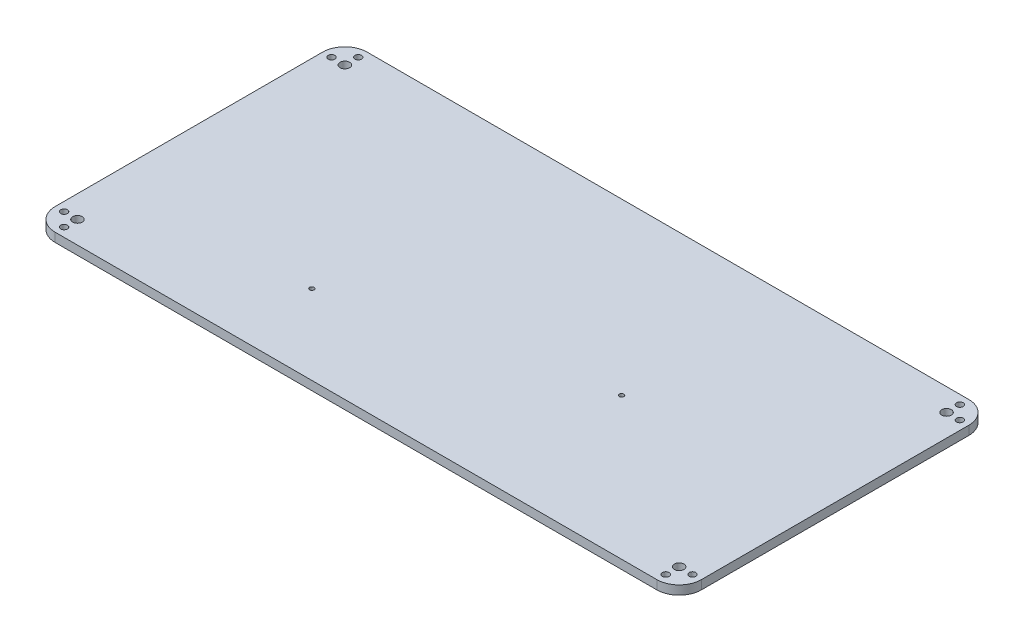
ISO-10303-21;
HEADER;
FILE_DESCRIPTION(('STEP AP214'),'2;1');
FILE_NAME('part.step','',(''),(''),'','','');
FILE_SCHEMA(('AUTOMOTIVE_DESIGN { 1 0 10303 214 1 1 1 1 }'));
ENDSEC;
DATA;
#1=APPLICATION_CONTEXT('core data for automotive mechanical design processes');
#2=APPLICATION_PROTOCOL_DEFINITION('international standard','automotive_design',2000,#1);
#3=PRODUCT_CONTEXT('',#1,'mechanical');
#4=PRODUCT('Part','Part','',(#3));
#5=PRODUCT_RELATED_PRODUCT_CATEGORY('part','',(#4));
#6=PRODUCT_DEFINITION_FORMATION('','',#4);
#7=PRODUCT_DEFINITION_CONTEXT('part definition',#1,'design');
#8=PRODUCT_DEFINITION('design','',#6,#7);
#9=PRODUCT_DEFINITION_SHAPE('','',#8);
#10=(LENGTH_UNIT() NAMED_UNIT(*) SI_UNIT(.MILLI.,.METRE.));
#11=(NAMED_UNIT(*) PLANE_ANGLE_UNIT() SI_UNIT($,.RADIAN.));
#12=(NAMED_UNIT(*) SI_UNIT($,.STERADIAN.) SOLID_ANGLE_UNIT());
#13=UNCERTAINTY_MEASURE_WITH_UNIT(LENGTH_MEASURE(1.E-05),#10,'distance_accuracy_value','');
#14=(GEOMETRIC_REPRESENTATION_CONTEXT(3) GLOBAL_UNCERTAINTY_ASSIGNED_CONTEXT((#13)) GLOBAL_UNIT_ASSIGNED_CONTEXT((#10,
#11,#12)) REPRESENTATION_CONTEXT('',''));
#15=CARTESIAN_POINT('',(0.,0.,0.));
#16=DIRECTION('',(0.,0.,1.));
#17=DIRECTION('',(1.,0.,0.));
#18=AXIS2_PLACEMENT_3D('',#15,#16,#17);
#19=CARTESIAN_POINT('',(0.,4.,70.));
#20=DIRECTION('',(0.,0.,1.));
#21=DIRECTION('',(1.,0.,0.));
#22=AXIS2_PLACEMENT_3D('',#19,#20,#21);
#23=PLANE('',#22);
#24=DIRECTION('',(-1.,0.,0.));
#25=VECTOR('',#24,1.);
#26=CARTESIAN_POINT('',(0.,0.,70.));
#27=LINE('',#26,#25);
#28=CARTESIAN_POINT('',(135.,0.,70.));
#29=VERTEX_POINT('',#28);
#30=CARTESIAN_POINT('',(-135.,0.,70.));
#31=VERTEX_POINT('',#30);
#32=EDGE_CURVE('E85',#29,#31,#27,.T.);
#33=ORIENTED_EDGE('',*,*,#32,.F.);
#34=DIRECTION('',(0.,-1.,0.));
#35=VECTOR('',#34,1.);
#36=CARTESIAN_POINT('',(135.,4.,70.));
#37=LINE('',#36,#35);
#38=CARTESIAN_POINT('',(135.,4.,70.));
#39=VERTEX_POINT('',#38);
#40=EDGE_CURVE('E11',#39,#29,#37,.T.);
#41=ORIENTED_EDGE('',*,*,#40,.F.);
#42=DIRECTION('',(-1.,0.,0.));
#43=VECTOR('',#42,1.);
#44=CARTESIAN_POINT('',(0.,4.,70.));
#45=LINE('',#44,#43);
#46=CARTESIAN_POINT('',(-135.,4.,70.));
#47=VERTEX_POINT('',#46);
#48=EDGE_CURVE('E71',#39,#47,#45,.T.);
#49=ORIENTED_EDGE('',*,*,#48,.T.);
#50=DIRECTION('',(0.,-1.,0.));
#51=VECTOR('',#50,1.);
#52=CARTESIAN_POINT('',(-135.,4.,70.));
#53=LINE('',#52,#51);
#54=EDGE_CURVE('E96',#47,#31,#53,.T.);
#55=ORIENTED_EDGE('',*,*,#54,.T.);
#56=EDGE_LOOP('',(#33,#41,#49,#55));
#57=FACE_BOUND('',#56,.T.);
#58=ADVANCED_FACE('F37',(#57),#23,.T.);
#59=CARTESIAN_POINT('',(135.,4.,60.));
#60=DIRECTION('',(0.,-1.,0.));
#61=DIRECTION('',(0.,0.,-1.));
#62=AXIS2_PLACEMENT_3D('',#59,#60,#61);
#63=CYLINDRICAL_SURFACE('',#62,10.);
#64=CARTESIAN_POINT('',(135.,0.,60.));
#65=DIRECTION('',(0.,1.,0.));
#66=DIRECTION('',(0.,0.,1.));
#67=AXIS2_PLACEMENT_3D('',#64,#65,#66);
#68=CIRCLE('',#67,10.);
#69=CARTESIAN_POINT('',(145.,0.,59.9999999999999));
#70=VERTEX_POINT('',#69);
#71=EDGE_CURVE('E93',#29,#70,#68,.T.);
#72=ORIENTED_EDGE('',*,*,#71,.T.);
#73=DIRECTION('',(0.,-1.,0.));
#74=VECTOR('',#73,1.);
#75=CARTESIAN_POINT('',(145.,4.,59.9999999999999));
#76=LINE('',#75,#74);
#77=CARTESIAN_POINT('',(145.,4.,59.9999999999999));
#78=VERTEX_POINT('',#77);
#79=EDGE_CURVE('E46',#78,#70,#76,.T.);
#80=ORIENTED_EDGE('',*,*,#79,.F.);
#81=CARTESIAN_POINT('',(135.,4.,60.));
#82=DIRECTION('',(0.,1.,0.));
#83=DIRECTION('',(0.,0.,1.));
#84=AXIS2_PLACEMENT_3D('',#81,#82,#83);
#85=CIRCLE('',#84,10.);
#86=EDGE_CURVE('E55',#39,#78,#85,.T.);
#87=ORIENTED_EDGE('',*,*,#86,.F.);
#88=ORIENTED_EDGE('',*,*,#40,.T.);
#89=EDGE_LOOP('',(#72,#80,#87,#88));
#90=FACE_BOUND('',#89,.T.);
#91=ADVANCED_FACE('F278',(#90),#63,.T.);
#92=CARTESIAN_POINT('',(145.,4.,0.));
#93=DIRECTION('',(1.,0.,0.));
#94=DIRECTION('',(0.,0.,-1.));
#95=AXIS2_PLACEMENT_3D('',#92,#93,#94);
#96=PLANE('',#95);
#97=DIRECTION('',(0.,0.,1.));
#98=VECTOR('',#97,1.);
#99=CARTESIAN_POINT('',(145.,0.,0.));
#100=LINE('',#99,#98);
#101=CARTESIAN_POINT('',(145.,0.,-59.9999999999999));
#102=VERTEX_POINT('',#101);
#103=EDGE_CURVE('E138',#102,#70,#100,.T.);
#104=ORIENTED_EDGE('',*,*,#103,.F.);
#105=DIRECTION('',(0.,-1.,0.));
#106=VECTOR('',#105,1.);
#107=CARTESIAN_POINT('',(145.,4.,-59.9999999999999));
#108=LINE('',#107,#106);
#109=CARTESIAN_POINT('',(145.,4.,-59.9999999999999));
#110=VERTEX_POINT('',#109);
#111=EDGE_CURVE('E188',#110,#102,#108,.T.);
#112=ORIENTED_EDGE('',*,*,#111,.F.);
#113=DIRECTION('',(0.,0.,1.));
#114=VECTOR('',#113,1.);
#115=CARTESIAN_POINT('',(145.,4.,0.));
#116=LINE('',#115,#114);
#117=EDGE_CURVE('E125',#110,#78,#116,.T.);
#118=ORIENTED_EDGE('',*,*,#117,.T.);
#119=ORIENTED_EDGE('',*,*,#79,.T.);
#120=EDGE_LOOP('',(#104,#112,#118,#119));
#121=FACE_BOUND('',#120,.T.);
#122=ADVANCED_FACE('F282',(#121),#96,.T.);
#123=CARTESIAN_POINT('',(141.,4.,60.));
#124=DIRECTION('',(0.,-1.,0.));
#125=DIRECTION('',(0.,0.,-1.));
#126=AXIS2_PLACEMENT_3D('',#123,#124,#125);
#127=CYLINDRICAL_SURFACE('',#126,1.5);
#128=CARTESIAN_POINT('',(141.,4.,60.));
#129=DIRECTION('',(0.,1.,0.));
#130=DIRECTION('',(0.,0.,1.));
#131=AXIS2_PLACEMENT_3D('',#128,#129,#130);
#132=CIRCLE('',#131,1.5);
#133=CARTESIAN_POINT('',(141.,4.,61.5));
#134=VERTEX_POINT('',#133);
#135=EDGE_CURVE('E131',#134,#134,#132,.T.);
#136=ORIENTED_EDGE('',*,*,#135,.T.);
#137=EDGE_LOOP('',(#136));
#138=FACE_BOUND('',#137,.T.);
#139=CARTESIAN_POINT('',(141.,0.,60.));
#140=DIRECTION('',(0.,1.,0.));
#141=DIRECTION('',(0.,0.,1.));
#142=AXIS2_PLACEMENT_3D('',#139,#140,#141);
#143=CIRCLE('',#142,1.5);
#144=CARTESIAN_POINT('',(141.,0.,61.5));
#145=VERTEX_POINT('',#144);
#146=EDGE_CURVE('E143',#145,#145,#143,.T.);
#147=ORIENTED_EDGE('',*,*,#146,.F.);
#148=EDGE_LOOP('',(#147));
#149=FACE_BOUND('',#148,.T.);
#150=ADVANCED_FACE('F286',(#138,#149),#127,.F.);
#151=CARTESIAN_POINT('',(135.,4.,60.));
#152=DIRECTION('',(0.,-1.,0.));
#153=DIRECTION('',(0.,0.,-1.));
#154=AXIS2_PLACEMENT_3D('',#151,#152,#153);
#155=CYLINDRICAL_SURFACE('',#154,2.15000000000002);
#156=CARTESIAN_POINT('',(135.,4.,60.));
#157=DIRECTION('',(0.,1.,0.));
#158=DIRECTION('',(0.,0.,1.));
#159=AXIS2_PLACEMENT_3D('',#156,#157,#158);
#160=CIRCLE('',#159,2.15000000000002);
#161=CARTESIAN_POINT('',(135.,4.,62.15));
#162=VERTEX_POINT('',#161);
#163=EDGE_CURVE('E128',#162,#162,#160,.T.);
#164=ORIENTED_EDGE('',*,*,#163,.T.);
#165=EDGE_LOOP('',(#164));
#166=FACE_BOUND('',#165,.T.);
#167=CARTESIAN_POINT('',(135.,0.,60.));
#168=DIRECTION('',(0.,1.,0.));
#169=DIRECTION('',(0.,0.,1.));
#170=AXIS2_PLACEMENT_3D('',#167,#168,#169);
#171=CIRCLE('',#170,2.15000000000002);
#172=CARTESIAN_POINT('',(135.,0.,62.15));
#173=VERTEX_POINT('',#172);
#174=EDGE_CURVE('E140',#173,#173,#171,.T.);
#175=ORIENTED_EDGE('',*,*,#174,.F.);
#176=EDGE_LOOP('',(#175));
#177=FACE_BOUND('',#176,.T.);
#178=ADVANCED_FACE('F290',(#166,#177),#155,.F.);
#179=CARTESIAN_POINT('',(134.999999999999,4.,66.));
#180=DIRECTION('',(0.,-1.,0.));
#181=DIRECTION('',(0.,0.,-1.));
#182=AXIS2_PLACEMENT_3D('',#179,#180,#181);
#183=CYLINDRICAL_SURFACE('',#182,1.5);
#184=CARTESIAN_POINT('',(134.999999999999,4.,66.));
#185=DIRECTION('',(0.,1.,0.));
#186=DIRECTION('',(0.,0.,1.));
#187=AXIS2_PLACEMENT_3D('',#184,#185,#186);
#188=CIRCLE('',#187,1.5);
#189=CARTESIAN_POINT('',(134.999999999999,4.,67.5));
#190=VERTEX_POINT('',#189);
#191=EDGE_CURVE('E134',#190,#190,#188,.F.);
#192=ORIENTED_EDGE('',*,*,#191,.F.);
#193=EDGE_LOOP('',(#192));
#194=FACE_BOUND('',#193,.T.);
#195=CARTESIAN_POINT('',(134.999999999999,0.,66.));
#196=DIRECTION('',(0.,1.,0.));
#197=DIRECTION('',(0.,0.,1.));
#198=AXIS2_PLACEMENT_3D('',#195,#196,#197);
#199=CIRCLE('',#198,1.5);
#200=CARTESIAN_POINT('',(134.999999999999,0.,67.5));
#201=VERTEX_POINT('',#200);
#202=EDGE_CURVE('E123',#201,#201,#199,.F.);
#203=ORIENTED_EDGE('',*,*,#202,.T.);
#204=EDGE_LOOP('',(#203));
#205=FACE_BOUND('',#204,.T.);
#206=ADVANCED_FACE('F243',(#194,#205),#183,.F.);
#207=CARTESIAN_POINT('',(0.,4.,0.));
#208=DIRECTION('',(0.,1.,0.));
#209=DIRECTION('',(0.,0.,1.));
#210=AXIS2_PLACEMENT_3D('',#207,#208,#209);
#211=PLANE('',#210);
#212=CARTESIAN_POINT('',(-55.5,4.,34.309138882773));
#213=DIRECTION('',(0.,1.,0.));
#214=DIRECTION('',(0.,0.,1.));
#215=AXIS2_PLACEMENT_3D('',#212,#213,#214);
#216=CIRCLE('',#215,1.);
#217=CARTESIAN_POINT('',(-55.5,4.,35.309138882773));
#218=VERTEX_POINT('',#217);
#219=EDGE_CURVE('E151',#218,#218,#216,.T.);
#220=ORIENTED_EDGE('',*,*,#219,.F.);
#221=EDGE_LOOP('',(#220));
#222=FACE_BOUND('',#221,.T.);
#223=CARTESIAN_POINT('',(55.5,4.,6.30913888277303));
#224=DIRECTION('',(0.,1.,0.));
#225=DIRECTION('',(0.,0.,1.));
#226=AXIS2_PLACEMENT_3D('',#223,#224,#225);
#227=CIRCLE('',#226,1.00000000000001);
#228=CARTESIAN_POINT('',(55.5,4.,7.30913888277303));
#229=VERTEX_POINT('',#228);
#230=EDGE_CURVE('E150',#229,#229,#227,.T.);
#231=ORIENTED_EDGE('',*,*,#230,.F.);
#232=EDGE_LOOP('',(#231));
#233=FACE_BOUND('',#232,.T.);
#234=ORIENTED_EDGE('',*,*,#117,.F.);
#235=CARTESIAN_POINT('',(135.,4.,-60.));
#236=DIRECTION('',(0.,-1.,0.));
#237=DIRECTION('',(0.,0.,-1.));
#238=AXIS2_PLACEMENT_3D('',#235,#236,#237);
#239=CIRCLE('',#238,10.);
#240=CARTESIAN_POINT('',(135.,4.,-70.));
#241=VERTEX_POINT('',#240);
#242=EDGE_CURVE('E163',#241,#110,#239,.T.);
#243=ORIENTED_EDGE('',*,*,#242,.F.);
#244=DIRECTION('',(1.,0.,0.));
#245=VECTOR('',#244,1.);
#246=CARTESIAN_POINT('',(0.,4.,-70.));
#247=LINE('',#246,#245);
#248=CARTESIAN_POINT('',(-135.,4.,-70.));
#249=VERTEX_POINT('',#248);
#250=EDGE_CURVE('E192',#249,#241,#247,.T.);
#251=ORIENTED_EDGE('',*,*,#250,.F.);
#252=CARTESIAN_POINT('',(-135.,4.,-60.));
#253=DIRECTION('',(0.,1.,0.));
#254=DIRECTION('',(0.,0.,-1.));
#255=AXIS2_PLACEMENT_3D('',#252,#253,#254);
#256=CIRCLE('',#255,10.);
#257=CARTESIAN_POINT('',(-145.,4.,-59.9999999999999));
#258=VERTEX_POINT('',#257);
#259=EDGE_CURVE('E195',#249,#258,#256,.T.);
#260=ORIENTED_EDGE('',*,*,#259,.T.);
#261=DIRECTION('',(0.,0.,1.));
#262=VECTOR('',#261,1.);
#263=CARTESIAN_POINT('',(-145.,4.,0.));
#264=LINE('',#263,#262);
#265=CARTESIAN_POINT('',(-145.,4.,59.9999999999999));
#266=VERTEX_POINT('',#265);
#267=EDGE_CURVE('E119',#258,#266,#264,.T.);
#268=ORIENTED_EDGE('',*,*,#267,.T.);
#269=CARTESIAN_POINT('',(-135.,4.,60.));
#270=DIRECTION('',(0.,-1.,0.));
#271=DIRECTION('',(0.,0.,1.));
#272=AXIS2_PLACEMENT_3D('',#269,#270,#271);
#273=CIRCLE('',#272,10.);
#274=EDGE_CURVE('E227',#47,#266,#273,.T.);
#275=ORIENTED_EDGE('',*,*,#274,.F.);
#276=ORIENTED_EDGE('',*,*,#48,.F.);
#277=ORIENTED_EDGE('',*,*,#86,.T.);
#278=EDGE_LOOP('',(#234,#243,#251,#260,#268,#275,#276,#277));
#279=FACE_BOUND('',#278,.T.);
#280=ORIENTED_EDGE('',*,*,#163,.F.);
#281=EDGE_LOOP('',(#280));
#282=FACE_BOUND('',#281,.T.);
#283=ORIENTED_EDGE('',*,*,#135,.F.);
#284=EDGE_LOOP('',(#283));
#285=FACE_BOUND('',#284,.T.);
#286=ORIENTED_EDGE('',*,*,#191,.T.);
#287=EDGE_LOOP('',(#286));
#288=FACE_BOUND('',#287,.T.);
#289=CARTESIAN_POINT('',(-135.,4.,60.));
#290=DIRECTION('',(0.,-1.,0.));
#291=DIRECTION('',(0.,0.,1.));
#292=AXIS2_PLACEMENT_3D('',#289,#290,#291);
#293=CIRCLE('',#292,2.15000000000002);
#294=CARTESIAN_POINT('',(-135.,4.,62.15));
#295=VERTEX_POINT('',#294);
#296=EDGE_CURVE('E229',#295,#295,#293,.T.);
#297=ORIENTED_EDGE('',*,*,#296,.T.);
#298=EDGE_LOOP('',(#297));
#299=FACE_BOUND('',#298,.T.);
#300=CARTESIAN_POINT('',(-141.,4.,60.));
#301=DIRECTION('',(0.,-1.,0.));
#302=DIRECTION('',(0.,0.,1.));
#303=AXIS2_PLACEMENT_3D('',#300,#301,#302);
#304=CIRCLE('',#303,1.5);
#305=CARTESIAN_POINT('',(-141.,4.,61.5));
#306=VERTEX_POINT('',#305);
#307=EDGE_CURVE('E232',#306,#306,#304,.T.);
#308=ORIENTED_EDGE('',*,*,#307,.T.);
#309=EDGE_LOOP('',(#308));
#310=FACE_BOUND('',#309,.T.);
#311=CARTESIAN_POINT('',(-134.999999999999,4.,66.));
#312=DIRECTION('',(0.,-1.,0.));
#313=DIRECTION('',(0.,0.,1.));
#314=AXIS2_PLACEMENT_3D('',#311,#312,#313);
#315=CIRCLE('',#314,1.5);
#316=CARTESIAN_POINT('',(-134.999999999999,4.,67.5));
#317=VERTEX_POINT('',#316);
#318=EDGE_CURVE('E100',#317,#317,#315,.F.);
#319=ORIENTED_EDGE('',*,*,#318,.F.);
#320=EDGE_LOOP('',(#319));
#321=FACE_BOUND('',#320,.T.);
#322=CARTESIAN_POINT('',(-135.,4.,-60.));
#323=DIRECTION('',(0.,1.,0.));
#324=DIRECTION('',(0.,0.,-1.));
#325=AXIS2_PLACEMENT_3D('',#322,#323,#324);
#326=CIRCLE('',#325,2.15000000000002);
#327=CARTESIAN_POINT('',(-135.,4.,-62.15));
#328=VERTEX_POINT('',#327);
#329=EDGE_CURVE('E199',#328,#328,#326,.T.);
#330=ORIENTED_EDGE('',*,*,#329,.F.);
#331=EDGE_LOOP('',(#330));
#332=FACE_BOUND('',#331,.T.);
#333=CARTESIAN_POINT('',(-141.,4.,-60.));
#334=DIRECTION('',(0.,1.,0.));
#335=DIRECTION('',(0.,0.,-1.));
#336=AXIS2_PLACEMENT_3D('',#333,#334,#335);
#337=CIRCLE('',#336,1.5);
#338=CARTESIAN_POINT('',(-141.,4.,-61.5));
#339=VERTEX_POINT('',#338);
#340=EDGE_CURVE('E202',#339,#339,#337,.T.);
#341=ORIENTED_EDGE('',*,*,#340,.F.);
#342=EDGE_LOOP('',(#341));
#343=FACE_BOUND('',#342,.T.);
#344=CARTESIAN_POINT('',(-134.999999999999,4.,-66.));
#345=DIRECTION('',(0.,1.,0.));
#346=DIRECTION('',(0.,0.,-1.));
#347=AXIS2_PLACEMENT_3D('',#344,#345,#346);
#348=CIRCLE('',#347,1.5);
#349=CARTESIAN_POINT('',(-134.999999999999,4.,-67.5));
#350=VERTEX_POINT('',#349);
#351=EDGE_CURVE('E205',#350,#350,#348,.F.);
#352=ORIENTED_EDGE('',*,*,#351,.T.);
#353=EDGE_LOOP('',(#352));
#354=FACE_BOUND('',#353,.T.);
#355=CARTESIAN_POINT('',(135.,4.,-60.));
#356=DIRECTION('',(0.,-1.,0.));
#357=DIRECTION('',(0.,0.,-1.));
#358=AXIS2_PLACEMENT_3D('',#355,#356,#357);
#359=CIRCLE('',#358,2.15000000000002);
#360=CARTESIAN_POINT('',(135.,4.,-62.15));
#361=VERTEX_POINT('',#360);
#362=EDGE_CURVE('E166',#361,#361,#359,.T.);
#363=ORIENTED_EDGE('',*,*,#362,.T.);
#364=EDGE_LOOP('',(#363));
#365=FACE_BOUND('',#364,.T.);
#366=CARTESIAN_POINT('',(141.,4.,-60.));
#367=DIRECTION('',(0.,-1.,0.));
#368=DIRECTION('',(0.,0.,-1.));
#369=AXIS2_PLACEMENT_3D('',#366,#367,#368);
#370=CIRCLE('',#369,1.5);
#371=CARTESIAN_POINT('',(141.,4.,-61.5));
#372=VERTEX_POINT('',#371);
#373=EDGE_CURVE('E170',#372,#372,#370,.T.);
#374=ORIENTED_EDGE('',*,*,#373,.T.);
#375=EDGE_LOOP('',(#374));
#376=FACE_BOUND('',#375,.T.);
#377=CARTESIAN_POINT('',(134.999999999999,4.,-66.));
#378=DIRECTION('',(0.,-1.,0.));
#379=DIRECTION('',(0.,0.,-1.));
#380=AXIS2_PLACEMENT_3D('',#377,#378,#379);
#381=CIRCLE('',#380,1.5);
#382=CARTESIAN_POINT('',(134.999999999999,4.,-67.5));
#383=VERTEX_POINT('',#382);
#384=EDGE_CURVE('E173',#383,#383,#381,.F.);
#385=ORIENTED_EDGE('',*,*,#384,.F.);
#386=EDGE_LOOP('',(#385));
#387=FACE_BOUND('',#386,.T.);
#388=ADVANCED_FACE('F240',(#222,#233,#279,#282,#285,#288,#299,#310,#321,#332,#343,#354,#365,
#376,#387),#211,.T.);
#389=CARTESIAN_POINT('',(0.,0.,0.));
#390=DIRECTION('',(0.,1.,0.));
#391=DIRECTION('',(0.,0.,1.));
#392=AXIS2_PLACEMENT_3D('',#389,#390,#391);
#393=PLANE('',#392);
#394=CARTESIAN_POINT('',(-55.5,0.,34.309138882773));
#395=DIRECTION('',(0.,1.,0.));
#396=DIRECTION('',(0.,0.,1.));
#397=AXIS2_PLACEMENT_3D('',#394,#395,#396);
#398=CIRCLE('',#397,1.);
#399=CARTESIAN_POINT('',(-55.5,0.,35.309138882773));
#400=VERTEX_POINT('',#399);
#401=EDGE_CURVE('E40',#400,#400,#398,.T.);
#402=ORIENTED_EDGE('',*,*,#401,.T.);
#403=EDGE_LOOP('',(#402));
#404=FACE_BOUND('',#403,.T.);
#405=CARTESIAN_POINT('',(55.5,0.,6.30913888277303));
#406=DIRECTION('',(0.,1.,0.));
#407=DIRECTION('',(0.,0.,1.));
#408=AXIS2_PLACEMENT_3D('',#405,#406,#407);
#409=CIRCLE('',#408,1.00000000000001);
#410=CARTESIAN_POINT('',(55.5,0.,7.30913888277303));
#411=VERTEX_POINT('',#410);
#412=EDGE_CURVE('E148',#411,#411,#409,.T.);
#413=ORIENTED_EDGE('',*,*,#412,.T.);
#414=EDGE_LOOP('',(#413));
#415=FACE_BOUND('',#414,.T.);
#416=CARTESIAN_POINT('',(135.,0.,-60.));
#417=DIRECTION('',(0.,-1.,0.));
#418=DIRECTION('',(0.,0.,-1.));
#419=AXIS2_PLACEMENT_3D('',#416,#417,#418);
#420=CIRCLE('',#419,10.);
#421=CARTESIAN_POINT('',(135.,0.,-70.));
#422=VERTEX_POINT('',#421);
#423=EDGE_CURVE('E155',#422,#102,#420,.T.);
#424=ORIENTED_EDGE('',*,*,#423,.T.);
#425=ORIENTED_EDGE('',*,*,#103,.T.);
#426=ORIENTED_EDGE('',*,*,#71,.F.);
#427=ORIENTED_EDGE('',*,*,#32,.T.);
#428=CARTESIAN_POINT('',(-135.,0.,60.));
#429=DIRECTION('',(0.,-1.,0.));
#430=DIRECTION('',(0.,0.,1.));
#431=AXIS2_PLACEMENT_3D('',#428,#429,#430);
#432=CIRCLE('',#431,10.);
#433=CARTESIAN_POINT('',(-145.,0.,59.9999999999999));
#434=VERTEX_POINT('',#433);
#435=EDGE_CURVE('E91',#31,#434,#432,.T.);
#436=ORIENTED_EDGE('',*,*,#435,.T.);
#437=DIRECTION('',(0.,0.,1.));
#438=VECTOR('',#437,1.);
#439=CARTESIAN_POINT('',(-145.,0.,0.));
#440=LINE('',#439,#438);
#441=CARTESIAN_POINT('',(-145.,0.,-59.9999999999999));
#442=VERTEX_POINT('',#441);
#443=EDGE_CURVE('E106',#442,#434,#440,.T.);
#444=ORIENTED_EDGE('',*,*,#443,.F.);
#445=CARTESIAN_POINT('',(-135.,0.,-60.));
#446=DIRECTION('',(0.,1.,0.));
#447=DIRECTION('',(0.,0.,-1.));
#448=AXIS2_PLACEMENT_3D('',#445,#446,#447);
#449=CIRCLE('',#448,10.);
#450=CARTESIAN_POINT('',(-135.,0.,-70.));
#451=VERTEX_POINT('',#450);
#452=EDGE_CURVE('E211',#451,#442,#449,.T.);
#453=ORIENTED_EDGE('',*,*,#452,.F.);
#454=DIRECTION('',(1.,0.,0.));
#455=VECTOR('',#454,1.);
#456=CARTESIAN_POINT('',(0.,0.,-70.));
#457=LINE('',#456,#455);
#458=EDGE_CURVE('E191',#451,#422,#457,.T.);
#459=ORIENTED_EDGE('',*,*,#458,.T.);
#460=EDGE_LOOP('',(#424,#425,#426,#427,#436,#444,#453,#459));
#461=FACE_BOUND('',#460,.T.);
#462=ORIENTED_EDGE('',*,*,#174,.T.);
#463=EDGE_LOOP('',(#462));
#464=FACE_BOUND('',#463,.T.);
#465=ORIENTED_EDGE('',*,*,#146,.T.);
#466=EDGE_LOOP('',(#465));
#467=FACE_BOUND('',#466,.T.);
#468=ORIENTED_EDGE('',*,*,#202,.F.);
#469=EDGE_LOOP('',(#468));
#470=FACE_BOUND('',#469,.T.);
#471=CARTESIAN_POINT('',(-135.,0.,60.));
#472=DIRECTION('',(0.,-1.,0.));
#473=DIRECTION('',(0.,0.,1.));
#474=AXIS2_PLACEMENT_3D('',#471,#472,#473);
#475=CIRCLE('',#474,2.15000000000002);
#476=CARTESIAN_POINT('',(-135.,0.,62.15));
#477=VERTEX_POINT('',#476);
#478=EDGE_CURVE('E105',#477,#477,#475,.T.);
#479=ORIENTED_EDGE('',*,*,#478,.F.);
#480=EDGE_LOOP('',(#479));
#481=FACE_BOUND('',#480,.T.);
#482=CARTESIAN_POINT('',(-141.,0.,60.));
#483=DIRECTION('',(0.,-1.,0.));
#484=DIRECTION('',(0.,0.,1.));
#485=AXIS2_PLACEMENT_3D('',#482,#483,#484);
#486=CIRCLE('',#485,1.5);
#487=CARTESIAN_POINT('',(-141.,0.,61.5));
#488=VERTEX_POINT('',#487);
#489=EDGE_CURVE('E109',#488,#488,#486,.T.);
#490=ORIENTED_EDGE('',*,*,#489,.F.);
#491=EDGE_LOOP('',(#490));
#492=FACE_BOUND('',#491,.T.);
#493=CARTESIAN_POINT('',(-134.999999999999,0.,66.));
#494=DIRECTION('',(0.,-1.,0.));
#495=DIRECTION('',(0.,0.,1.));
#496=AXIS2_PLACEMENT_3D('',#493,#494,#495);
#497=CIRCLE('',#496,1.5);
#498=CARTESIAN_POINT('',(-134.999999999999,0.,67.5));
#499=VERTEX_POINT('',#498);
#500=EDGE_CURVE('E117',#499,#499,#497,.F.);
#501=ORIENTED_EDGE('',*,*,#500,.T.);
#502=EDGE_LOOP('',(#501));
#503=FACE_BOUND('',#502,.T.);
#504=CARTESIAN_POINT('',(-135.,0.,-60.));
#505=DIRECTION('',(0.,1.,0.));
#506=DIRECTION('',(0.,0.,-1.));
#507=AXIS2_PLACEMENT_3D('',#504,#505,#506);
#508=CIRCLE('',#507,2.15000000000002);
#509=CARTESIAN_POINT('',(-135.,0.,-62.15));
#510=VERTEX_POINT('',#509);
#511=EDGE_CURVE('E214',#510,#510,#508,.T.);
#512=ORIENTED_EDGE('',*,*,#511,.T.);
#513=EDGE_LOOP('',(#512));
#514=FACE_BOUND('',#513,.T.);
#515=CARTESIAN_POINT('',(-141.,0.,-60.));
#516=DIRECTION('',(0.,1.,0.));
#517=DIRECTION('',(0.,0.,-1.));
#518=AXIS2_PLACEMENT_3D('',#515,#516,#517);
#519=CIRCLE('',#518,1.5);
#520=CARTESIAN_POINT('',(-141.,0.,-61.5));
#521=VERTEX_POINT('',#520);
#522=EDGE_CURVE('E217',#521,#521,#519,.T.);
#523=ORIENTED_EDGE('',*,*,#522,.T.);
#524=EDGE_LOOP('',(#523));
#525=FACE_BOUND('',#524,.T.);
#526=CARTESIAN_POINT('',(-134.999999999999,0.,-66.));
#527=DIRECTION('',(0.,1.,0.));
#528=DIRECTION('',(0.,0.,-1.));
#529=AXIS2_PLACEMENT_3D('',#526,#527,#528);
#530=CIRCLE('',#529,1.5);
#531=CARTESIAN_POINT('',(-134.999999999999,0.,-67.5));
#532=VERTEX_POINT('',#531);
#533=EDGE_CURVE('E196',#532,#532,#530,.F.);
#534=ORIENTED_EDGE('',*,*,#533,.F.);
#535=EDGE_LOOP('',(#534));
#536=FACE_BOUND('',#535,.T.);
#537=CARTESIAN_POINT('',(135.,0.,-60.));
#538=DIRECTION('',(0.,-1.,0.));
#539=DIRECTION('',(0.,0.,-1.));
#540=AXIS2_PLACEMENT_3D('',#537,#538,#539);
#541=CIRCLE('',#540,2.15000000000002);
#542=CARTESIAN_POINT('',(135.,0.,-62.15));
#543=VERTEX_POINT('',#542);
#544=EDGE_CURVE('E178',#543,#543,#541,.T.);
#545=ORIENTED_EDGE('',*,*,#544,.F.);
#546=EDGE_LOOP('',(#545));
#547=FACE_BOUND('',#546,.T.);
#548=CARTESIAN_POINT('',(141.,0.,-60.));
#549=DIRECTION('',(0.,-1.,0.));
#550=DIRECTION('',(0.,0.,-1.));
#551=AXIS2_PLACEMENT_3D('',#548,#549,#550);
#552=CIRCLE('',#551,1.5);
#553=CARTESIAN_POINT('',(141.,0.,-61.5));
#554=VERTEX_POINT('',#553);
#555=EDGE_CURVE('E181',#554,#554,#552,.T.);
#556=ORIENTED_EDGE('',*,*,#555,.F.);
#557=EDGE_LOOP('',(#556));
#558=FACE_BOUND('',#557,.T.);
#559=CARTESIAN_POINT('',(134.999999999999,0.,-66.));
#560=DIRECTION('',(0.,-1.,0.));
#561=DIRECTION('',(0.,0.,-1.));
#562=AXIS2_PLACEMENT_3D('',#559,#560,#561);
#563=CIRCLE('',#562,1.5);
#564=CARTESIAN_POINT('',(134.999999999999,0.,-67.5));
#565=VERTEX_POINT('',#564);
#566=EDGE_CURVE('E167',#565,#565,#563,.F.);
#567=ORIENTED_EDGE('',*,*,#566,.T.);
#568=EDGE_LOOP('',(#567));
#569=FACE_BOUND('',#568,.T.);
#570=ADVANCED_FACE('F87',(#404,#415,#461,#464,#467,#470,#481,#492,#503,#514,#525,#536,#547,#558,
#569),#393,.F.);
#571=CARTESIAN_POINT('',(-145.,4.,0.));
#572=DIRECTION('',(1.,0.,0.));
#573=DIRECTION('',(0.,0.,-1.));
#574=AXIS2_PLACEMENT_3D('',#571,#572,#573);
#575=PLANE('',#574);
#576=ORIENTED_EDGE('',*,*,#443,.T.);
#577=DIRECTION('',(0.,-1.,0.));
#578=VECTOR('',#577,1.);
#579=CARTESIAN_POINT('',(-145.,4.,59.9999999999999));
#580=LINE('',#579,#578);
#581=EDGE_CURVE('E94',#266,#434,#580,.T.);
#582=ORIENTED_EDGE('',*,*,#581,.F.);
#583=ORIENTED_EDGE('',*,*,#267,.F.);
#584=DIRECTION('',(0.,-1.,0.));
#585=VECTOR('',#584,1.);
#586=CARTESIAN_POINT('',(-145.,4.,-59.9999999999999));
#587=LINE('',#586,#585);
#588=EDGE_CURVE('E208',#258,#442,#587,.T.);
#589=ORIENTED_EDGE('',*,*,#588,.T.);
#590=EDGE_LOOP('',(#576,#582,#583,#589));
#591=FACE_BOUND('',#590,.T.);
#592=ADVANCED_FACE('F267',(#591),#575,.F.);
#593=CARTESIAN_POINT('',(-141.,4.,60.));
#594=DIRECTION('',(0.,-1.,0.));
#595=DIRECTION('',(0.,0.,-1.));
#596=AXIS2_PLACEMENT_3D('',#593,#594,#595);
#597=CYLINDRICAL_SURFACE('',#596,1.5);
#598=ORIENTED_EDGE('',*,*,#307,.F.);
#599=EDGE_LOOP('',(#598));
#600=FACE_BOUND('',#599,.T.);
#601=ORIENTED_EDGE('',*,*,#489,.T.);
#602=EDGE_LOOP('',(#601));
#603=FACE_BOUND('',#602,.T.);
#604=ADVANCED_FACE('F273',(#600,#603),#597,.F.);
#605=CARTESIAN_POINT('',(-135.,4.,60.));
#606=DIRECTION('',(0.,-1.,0.));
#607=DIRECTION('',(0.,0.,-1.));
#608=AXIS2_PLACEMENT_3D('',#605,#606,#607);
#609=CYLINDRICAL_SURFACE('',#608,2.15000000000002);
#610=ORIENTED_EDGE('',*,*,#296,.F.);
#611=EDGE_LOOP('',(#610));
#612=FACE_BOUND('',#611,.T.);
#613=ORIENTED_EDGE('',*,*,#478,.T.);
#614=EDGE_LOOP('',(#613));
#615=FACE_BOUND('',#614,.T.);
#616=ADVANCED_FACE('F360',(#612,#615),#609,.F.);
#617=CARTESIAN_POINT('',(-135.,4.,60.));
#618=DIRECTION('',(0.,-1.,0.));
#619=DIRECTION('',(0.,0.,-1.));
#620=AXIS2_PLACEMENT_3D('',#617,#618,#619);
#621=CYLINDRICAL_SURFACE('',#620,10.);
#622=ORIENTED_EDGE('',*,*,#435,.F.);
#623=ORIENTED_EDGE('',*,*,#54,.F.);
#624=ORIENTED_EDGE('',*,*,#274,.T.);
#625=ORIENTED_EDGE('',*,*,#581,.T.);
#626=EDGE_LOOP('',(#622,#623,#624,#625));
#627=FACE_BOUND('',#626,.T.);
#628=ADVANCED_FACE('F102',(#627),#621,.T.);
#629=CARTESIAN_POINT('',(-134.999999999999,4.,66.));
#630=DIRECTION('',(0.,-1.,0.));
#631=DIRECTION('',(0.,0.,-1.));
#632=AXIS2_PLACEMENT_3D('',#629,#630,#631);
#633=CYLINDRICAL_SURFACE('',#632,1.5);
#634=ORIENTED_EDGE('',*,*,#318,.T.);
#635=EDGE_LOOP('',(#634));
#636=FACE_BOUND('',#635,.T.);
#637=ORIENTED_EDGE('',*,*,#500,.F.);
#638=EDGE_LOOP('',(#637));
#639=FACE_BOUND('',#638,.T.);
#640=ADVANCED_FACE('F237',(#636,#639),#633,.F.);
#641=CARTESIAN_POINT('',(0.,4.,-70.));
#642=DIRECTION('',(0.,0.,-1.));
#643=DIRECTION('',(-1.,0.,0.));
#644=AXIS2_PLACEMENT_3D('',#641,#642,#643);
#645=PLANE('',#644);
#646=ORIENTED_EDGE('',*,*,#458,.F.);
#647=DIRECTION('',(0.,-1.,0.));
#648=VECTOR('',#647,1.);
#649=CARTESIAN_POINT('',(-135.,4.,-70.));
#650=LINE('',#649,#648);
#651=EDGE_CURVE('E111',#249,#451,#650,.T.);
#652=ORIENTED_EDGE('',*,*,#651,.F.);
#653=ORIENTED_EDGE('',*,*,#250,.T.);
#654=DIRECTION('',(0.,-1.,0.));
#655=VECTOR('',#654,1.);
#656=CARTESIAN_POINT('',(135.,4.,-70.));
#657=LINE('',#656,#655);
#658=EDGE_CURVE('E176',#241,#422,#657,.T.);
#659=ORIENTED_EDGE('',*,*,#658,.T.);
#660=EDGE_LOOP('',(#646,#652,#653,#659));
#661=FACE_BOUND('',#660,.T.);
#662=ADVANCED_FACE('F351',(#661),#645,.T.);
#663=CARTESIAN_POINT('',(-135.,4.,-60.));
#664=DIRECTION('',(0.,-1.,0.));
#665=DIRECTION('',(0.,0.,-1.));
#666=AXIS2_PLACEMENT_3D('',#663,#664,#665);
#667=CYLINDRICAL_SURFACE('',#666,10.);
#668=ORIENTED_EDGE('',*,*,#452,.T.);
#669=ORIENTED_EDGE('',*,*,#588,.F.);
#670=ORIENTED_EDGE('',*,*,#259,.F.);
#671=ORIENTED_EDGE('',*,*,#651,.T.);
#672=EDGE_LOOP('',(#668,#669,#670,#671));
#673=FACE_BOUND('',#672,.T.);
#674=ADVANCED_FACE('F344',(#673),#667,.T.);
#675=CARTESIAN_POINT('',(-141.,4.,-60.));
#676=DIRECTION('',(0.,-1.,0.));
#677=DIRECTION('',(0.,0.,-1.));
#678=AXIS2_PLACEMENT_3D('',#675,#676,#677);
#679=CYLINDRICAL_SURFACE('',#678,1.5);
#680=ORIENTED_EDGE('',*,*,#340,.T.);
#681=EDGE_LOOP('',(#680));
#682=FACE_BOUND('',#681,.T.);
#683=ORIENTED_EDGE('',*,*,#522,.F.);
#684=EDGE_LOOP('',(#683));
#685=FACE_BOUND('',#684,.T.);
#686=ADVANCED_FACE('F341',(#682,#685),#679,.F.);
#687=CARTESIAN_POINT('',(-135.,4.,-60.));
#688=DIRECTION('',(0.,-1.,0.));
#689=DIRECTION('',(0.,0.,-1.));
#690=AXIS2_PLACEMENT_3D('',#687,#688,#689);
#691=CYLINDRICAL_SURFACE('',#690,2.15000000000002);
#692=ORIENTED_EDGE('',*,*,#329,.T.);
#693=EDGE_LOOP('',(#692));
#694=FACE_BOUND('',#693,.T.);
#695=ORIENTED_EDGE('',*,*,#511,.F.);
#696=EDGE_LOOP('',(#695));
#697=FACE_BOUND('',#696,.T.);
#698=ADVANCED_FACE('F333',(#694,#697),#691,.F.);
#699=CARTESIAN_POINT('',(-134.999999999999,4.,-66.));
#700=DIRECTION('',(0.,-1.,0.));
#701=DIRECTION('',(0.,0.,-1.));
#702=AXIS2_PLACEMENT_3D('',#699,#700,#701);
#703=CYLINDRICAL_SURFACE('',#702,1.5);
#704=ORIENTED_EDGE('',*,*,#351,.F.);
#705=EDGE_LOOP('',(#704));
#706=FACE_BOUND('',#705,.T.);
#707=ORIENTED_EDGE('',*,*,#533,.T.);
#708=EDGE_LOOP('',(#707));
#709=FACE_BOUND('',#708,.T.);
#710=ADVANCED_FACE('F324',(#706,#709),#703,.F.);
#711=CARTESIAN_POINT('',(141.,4.,-60.));
#712=DIRECTION('',(0.,-1.,0.));
#713=DIRECTION('',(0.,0.,-1.));
#714=AXIS2_PLACEMENT_3D('',#711,#712,#713);
#715=CYLINDRICAL_SURFACE('',#714,1.5);
#716=ORIENTED_EDGE('',*,*,#373,.F.);
#717=EDGE_LOOP('',(#716));
#718=FACE_BOUND('',#717,.T.);
#719=ORIENTED_EDGE('',*,*,#555,.T.);
#720=EDGE_LOOP('',(#719));
#721=FACE_BOUND('',#720,.T.);
#722=ADVANCED_FACE('F321',(#718,#721),#715,.F.);
#723=CARTESIAN_POINT('',(135.,4.,-60.));
#724=DIRECTION('',(0.,-1.,0.));
#725=DIRECTION('',(0.,0.,-1.));
#726=AXIS2_PLACEMENT_3D('',#723,#724,#725);
#727=CYLINDRICAL_SURFACE('',#726,2.15000000000002);
#728=ORIENTED_EDGE('',*,*,#362,.F.);
#729=EDGE_LOOP('',(#728));
#730=FACE_BOUND('',#729,.T.);
#731=ORIENTED_EDGE('',*,*,#544,.T.);
#732=EDGE_LOOP('',(#731));
#733=FACE_BOUND('',#732,.T.);
#734=ADVANCED_FACE('F323',(#730,#733),#727,.F.);
#735=CARTESIAN_POINT('',(135.,4.,-60.));
#736=DIRECTION('',(0.,-1.,0.));
#737=DIRECTION('',(0.,0.,-1.));
#738=AXIS2_PLACEMENT_3D('',#735,#736,#737);
#739=CYLINDRICAL_SURFACE('',#738,10.);
#740=ORIENTED_EDGE('',*,*,#423,.F.);
#741=ORIENTED_EDGE('',*,*,#658,.F.);
#742=ORIENTED_EDGE('',*,*,#242,.T.);
#743=ORIENTED_EDGE('',*,*,#111,.T.);
#744=EDGE_LOOP('',(#740,#741,#742,#743));
#745=FACE_BOUND('',#744,.T.);
#746=ADVANCED_FACE('F262',(#745),#739,.T.);
#747=CARTESIAN_POINT('',(134.999999999999,4.,-66.));
#748=DIRECTION('',(0.,-1.,0.));
#749=DIRECTION('',(0.,0.,-1.));
#750=AXIS2_PLACEMENT_3D('',#747,#748,#749);
#751=CYLINDRICAL_SURFACE('',#750,1.5);
#752=ORIENTED_EDGE('',*,*,#384,.T.);
#753=EDGE_LOOP('',(#752));
#754=FACE_BOUND('',#753,.T.);
#755=ORIENTED_EDGE('',*,*,#566,.F.);
#756=EDGE_LOOP('',(#755));
#757=FACE_BOUND('',#756,.T.);
#758=ADVANCED_FACE('F258',(#754,#757),#751,.F.);
#759=CARTESIAN_POINT('',(55.5,-4.,6.30913888277303));
#760=DIRECTION('',(0.,1.,0.));
#761=DIRECTION('',(0.,0.,1.));
#762=AXIS2_PLACEMENT_3D('',#759,#760,#761);
#763=CYLINDRICAL_SURFACE('',#762,1.00000000000001);
#764=ORIENTED_EDGE('',*,*,#230,.T.);
#765=EDGE_LOOP('',(#764));
#766=FACE_BOUND('',#765,.T.);
#767=ORIENTED_EDGE('',*,*,#412,.F.);
#768=EDGE_LOOP('',(#767));
#769=FACE_BOUND('',#768,.T.);
#770=ADVANCED_FACE('F261',(#766,#769),#763,.F.);
#771=CARTESIAN_POINT('',(-55.5,-4.,34.309138882773));
#772=DIRECTION('',(0.,1.,0.));
#773=DIRECTION('',(0.,0.,1.));
#774=AXIS2_PLACEMENT_3D('',#771,#772,#773);
#775=CYLINDRICAL_SURFACE('',#774,1.);
#776=ORIENTED_EDGE('',*,*,#219,.T.);
#777=EDGE_LOOP('',(#776));
#778=FACE_BOUND('',#777,.T.);
#779=ORIENTED_EDGE('',*,*,#401,.F.);
#780=EDGE_LOOP('',(#779));
#781=FACE_BOUND('',#780,.T.);
#782=ADVANCED_FACE('F440',(#778,#781),#775,.F.);
#783=CLOSED_SHELL('',(#58,#91,#122,#150,#178,#206,#388,#570,#592,#604,#616,#628,#640,#662,#674,
#686,#698,#710,#722,#734,#746,#758,#770,#782));
#784=MANIFOLD_SOLID_BREP('B2',#783);
#785=ADVANCED_BREP_SHAPE_REPRESENTATION('',(#18,#784),#14);
#786=SHAPE_DEFINITION_REPRESENTATION(#9,#785);
ENDSEC;
END-ISO-10303-21;
